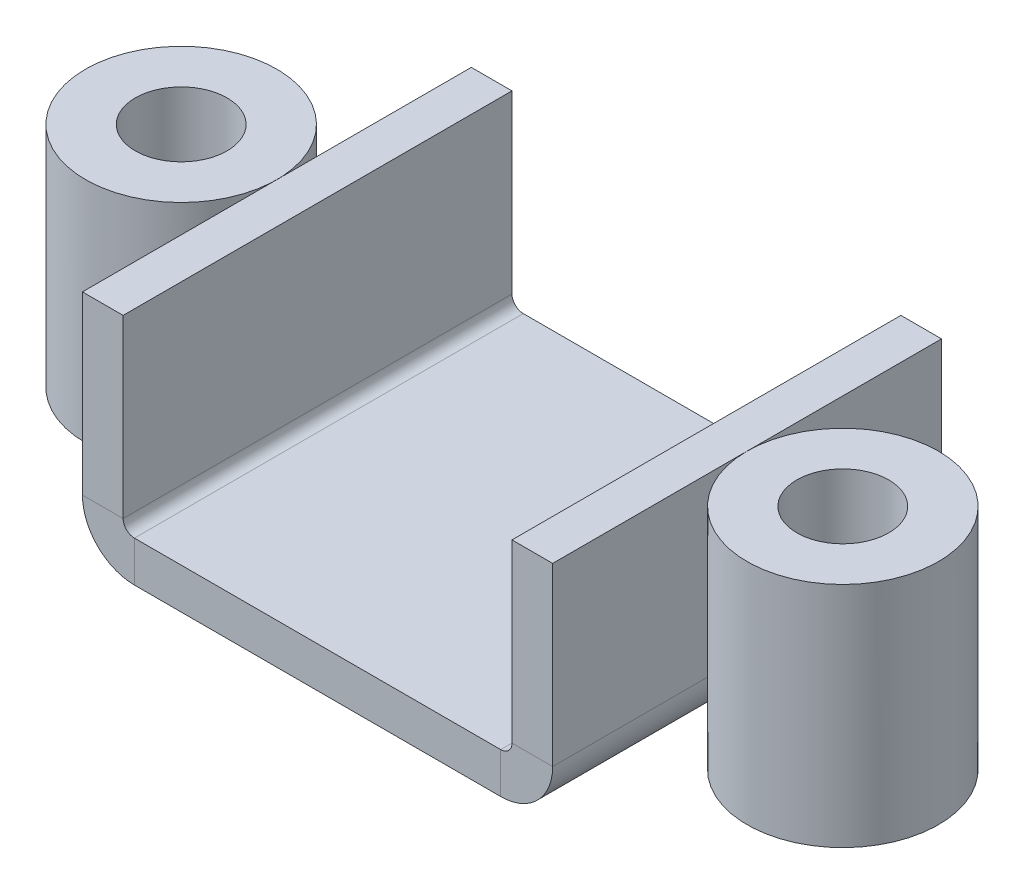
ISO-10303-21;
HEADER;
FILE_DESCRIPTION(('STEP AP214'),'2;1');
FILE_NAME('part.step','',(''),(''),'','','');
FILE_SCHEMA(('AUTOMOTIVE_DESIGN { 1 0 10303 214 1 1 1 1 }'));
ENDSEC;
DATA;
#1=APPLICATION_CONTEXT('core data for automotive mechanical design processes');
#2=APPLICATION_PROTOCOL_DEFINITION('international standard','automotive_design',2000,#1);
#3=PRODUCT_CONTEXT('',#1,'mechanical');
#4=PRODUCT('Part','Part','',(#3));
#5=PRODUCT_RELATED_PRODUCT_CATEGORY('part','',(#4));
#6=PRODUCT_DEFINITION_FORMATION('','',#4);
#7=PRODUCT_DEFINITION_CONTEXT('part definition',#1,'design');
#8=PRODUCT_DEFINITION('design','',#6,#7);
#9=PRODUCT_DEFINITION_SHAPE('','',#8);
#10=(LENGTH_UNIT() NAMED_UNIT(*) SI_UNIT(.MILLI.,.METRE.));
#11=(NAMED_UNIT(*) PLANE_ANGLE_UNIT() SI_UNIT($,.RADIAN.));
#12=(NAMED_UNIT(*) SI_UNIT($,.STERADIAN.) SOLID_ANGLE_UNIT());
#13=UNCERTAINTY_MEASURE_WITH_UNIT(LENGTH_MEASURE(1.E-05),#10,'distance_accuracy_value','');
#14=(GEOMETRIC_REPRESENTATION_CONTEXT(3) GLOBAL_UNCERTAINTY_ASSIGNED_CONTEXT((#13)) GLOBAL_UNIT_ASSIGNED_CONTEXT((#10,
#11,#12)) REPRESENTATION_CONTEXT('',''));
#15=CARTESIAN_POINT('',(0.,0.,0.));
#16=DIRECTION('',(0.,0.,1.));
#17=DIRECTION('',(1.,0.,0.));
#18=AXIS2_PLACEMENT_3D('',#15,#16,#17);
#19=CARTESIAN_POINT('',(-21.60684,29.9071436989057,0.));
#20=DIRECTION('',(0.,-1.,0.));
#21=DIRECTION('',(0.,0.,-1.));
#22=AXIS2_PLACEMENT_3D('',#19,#20,#21);
#23=CYLINDRICAL_SURFACE('',#22,6.25);
#24=CARTESIAN_POINT('',(-21.60684,-2.65684,0.));
#25=DIRECTION('',(0.,-1.,0.));
#26=DIRECTION('',(0.,0.,1.));
#27=AXIS2_PLACEMENT_3D('',#24,#25,#26);
#28=CIRCLE('',#27,6.25);
#29=CARTESIAN_POINT('',(-21.60684,-2.65684,6.25));
#30=VERTEX_POINT('',#29);
#31=EDGE_CURVE('E67',#30,#30,#28,.T.);
#32=ORIENTED_EDGE('',*,*,#31,.F.);
#33=EDGE_LOOP('',(#32));
#34=FACE_BOUND('',#33,.T.);
#35=CARTESIAN_POINT('',(-21.60684,12.2294741692419,0.));
#36=DIRECTION('',(0.,1.,0.));
#37=DIRECTION('',(-1.,0.,0.));
#38=AXIS2_PLACEMENT_3D('',#35,#36,#37);
#39=CIRCLE('',#38,6.25);
#40=CARTESIAN_POINT('',(-27.85684,12.2294741692418,0.));
#41=VERTEX_POINT('',#40);
#42=EDGE_CURVE('E12',#41,#41,#39,.F.);
#43=ORIENTED_EDGE('',*,*,#42,.T.);
#44=EDGE_LOOP('',(#43));
#45=FACE_BOUND('',#44,.T.);
#46=ADVANCED_FACE('F63',(#34,#45),#23,.T.);
#47=CARTESIAN_POINT('',(-21.60684,29.9071436989057,0.));
#48=DIRECTION('',(0.,-1.,0.));
#49=DIRECTION('',(0.,0.,-1.));
#50=AXIS2_PLACEMENT_3D('',#47,#48,#49);
#51=CYLINDRICAL_SURFACE('',#50,3.);
#52=CARTESIAN_POINT('',(-21.60684,-2.65684,0.));
#53=DIRECTION('',(0.,-1.,0.));
#54=DIRECTION('',(0.,0.,1.));
#55=AXIS2_PLACEMENT_3D('',#52,#53,#54);
#56=CIRCLE('',#55,3.);
#57=CARTESIAN_POINT('',(-21.60684,-2.65684,2.99999999999999));
#58=VERTEX_POINT('',#57);
#59=EDGE_CURVE('E72',#58,#58,#56,.T.);
#60=ORIENTED_EDGE('',*,*,#59,.T.);
#61=EDGE_LOOP('',(#60));
#62=FACE_BOUND('',#61,.T.);
#63=CARTESIAN_POINT('',(-21.60684,12.2294741692419,0.));
#64=DIRECTION('',(0.,1.,0.));
#65=DIRECTION('',(-1.,0.,0.));
#66=AXIS2_PLACEMENT_3D('',#63,#64,#65);
#67=CIRCLE('',#66,3.);
#68=CARTESIAN_POINT('',(-24.60684,12.2294741692419,0.));
#69=VERTEX_POINT('',#68);
#70=EDGE_CURVE('E80',#69,#69,#67,.F.);
#71=ORIENTED_EDGE('',*,*,#70,.F.);
#72=EDGE_LOOP('',(#71));
#73=FACE_BOUND('',#72,.T.);
#74=ADVANCED_FACE('F93',(#62,#73),#51,.F.);
#75=CARTESIAN_POINT('',(-21.60684,-2.65684,0.));
#76=DIRECTION('',(0.,1.,0.));
#77=DIRECTION('',(0.,0.,1.));
#78=AXIS2_PLACEMENT_3D('',#75,#76,#77);
#79=PLANE('',#78);
#80=ORIENTED_EDGE('',*,*,#59,.F.);
#81=EDGE_LOOP('',(#80));
#82=FACE_BOUND('',#81,.T.);
#83=ORIENTED_EDGE('',*,*,#31,.T.);
#84=EDGE_LOOP('',(#83));
#85=FACE_BOUND('',#84,.T.);
#86=ADVANCED_FACE('F65',(#82,#85),#79,.F.);
#87=CARTESIAN_POINT('',(15.35684,12.229474169242,12.7));
#88=DIRECTION('',(0.,1.,0.));
#89=DIRECTION('',(0.,0.,-1.));
#90=AXIS2_PLACEMENT_3D('',#87,#88,#89);
#91=PLANE('',#90);
#92=ORIENTED_EDGE('',*,*,#42,.F.);
#93=EDGE_LOOP('',(#92));
#94=FACE_BOUND('',#93,.T.);
#95=ORIENTED_EDGE('',*,*,#70,.T.);
#96=EDGE_LOOP('',(#95));
#97=FACE_BOUND('',#96,.T.);
#98=ADVANCED_FACE('F100',(#94,#97),#91,.T.);
#99=CLOSED_SHELL('',(#46,#74,#86,#98));
#100=MANIFOLD_SOLID_BREP('B2',#99);
#101=CARTESIAN_POINT('',(21.60684,29.9071436989057,0.));
#102=DIRECTION('',(0.,-1.,0.));
#103=DIRECTION('',(0.,0.,-1.));
#104=AXIS2_PLACEMENT_3D('',#101,#102,#103);
#105=CYLINDRICAL_SURFACE('',#104,6.25);
#106=CARTESIAN_POINT('',(21.60684,-2.65684,0.));
#107=DIRECTION('',(0.,-1.,0.));
#108=DIRECTION('',(0.,0.,-1.));
#109=AXIS2_PLACEMENT_3D('',#106,#107,#108);
#110=CIRCLE('',#109,6.25);
#111=CARTESIAN_POINT('',(21.60684,-2.65684,-6.25));
#112=VERTEX_POINT('',#111);
#113=EDGE_CURVE('E149',#112,#112,#110,.T.);
#114=ORIENTED_EDGE('',*,*,#113,.F.);
#115=EDGE_LOOP('',(#114));
#116=FACE_BOUND('',#115,.T.);
#117=CARTESIAN_POINT('',(21.60684,12.229474169242,0.));
#118=DIRECTION('',(0.,1.,0.));
#119=DIRECTION('',(-1.,0.,0.));
#120=AXIS2_PLACEMENT_3D('',#117,#118,#119);
#121=CIRCLE('',#120,6.25);
#122=CARTESIAN_POINT('',(15.35684,12.229474169242,0.));
#123=VERTEX_POINT('',#122);
#124=EDGE_CURVE('E162',#123,#123,#121,.F.);
#125=ORIENTED_EDGE('',*,*,#124,.T.);
#126=EDGE_LOOP('',(#125));
#127=FACE_BOUND('',#126,.T.);
#128=ADVANCED_FACE('F141',(#116,#127),#105,.T.);
#129=CARTESIAN_POINT('',(21.60684,29.9071436989057,0.));
#130=DIRECTION('',(0.,-1.,0.));
#131=DIRECTION('',(0.,0.,-1.));
#132=AXIS2_PLACEMENT_3D('',#129,#130,#131);
#133=CYLINDRICAL_SURFACE('',#132,3.);
#134=CARTESIAN_POINT('',(21.60684,-2.65684,0.));
#135=DIRECTION('',(0.,-1.,0.));
#136=DIRECTION('',(0.,0.,-1.));
#137=AXIS2_PLACEMENT_3D('',#134,#135,#136);
#138=CIRCLE('',#137,3.);
#139=CARTESIAN_POINT('',(21.60684,-2.65684,-3.));
#140=VERTEX_POINT('',#139);
#141=EDGE_CURVE('E155',#140,#140,#138,.T.);
#142=ORIENTED_EDGE('',*,*,#141,.T.);
#143=EDGE_LOOP('',(#142));
#144=FACE_BOUND('',#143,.T.);
#145=CARTESIAN_POINT('',(21.60684,12.229474169242,0.));
#146=DIRECTION('',(0.,1.,0.));
#147=DIRECTION('',(-1.,0.,0.));
#148=AXIS2_PLACEMENT_3D('',#145,#146,#147);
#149=CIRCLE('',#148,3.);
#150=CARTESIAN_POINT('',(18.60684,12.229474169242,0.));
#151=VERTEX_POINT('',#150);
#152=EDGE_CURVE('E62',#151,#151,#149,.F.);
#153=ORIENTED_EDGE('',*,*,#152,.F.);
#154=EDGE_LOOP('',(#153));
#155=FACE_BOUND('',#154,.T.);
#156=ADVANCED_FACE('F175',(#144,#155),#133,.F.);
#157=CARTESIAN_POINT('',(21.60684,-2.65684,0.));
#158=DIRECTION('',(0.,-1.,0.));
#159=DIRECTION('',(0.,0.,-1.));
#160=AXIS2_PLACEMENT_3D('',#157,#158,#159);
#161=PLANE('',#160);
#162=ORIENTED_EDGE('',*,*,#141,.F.);
#163=EDGE_LOOP('',(#162));
#164=FACE_BOUND('',#163,.T.);
#165=ORIENTED_EDGE('',*,*,#113,.T.);
#166=EDGE_LOOP('',(#165));
#167=FACE_BOUND('',#166,.T.);
#168=ADVANCED_FACE('F171',(#164,#167),#161,.T.);
#169=CARTESIAN_POINT('',(15.35684,12.229474169242,12.7));
#170=DIRECTION('',(0.,1.,0.));
#171=DIRECTION('',(0.,0.,-1.));
#172=AXIS2_PLACEMENT_3D('',#169,#170,#171);
#173=PLANE('',#172);
#174=ORIENTED_EDGE('',*,*,#124,.F.);
#175=EDGE_LOOP('',(#174));
#176=FACE_BOUND('',#175,.T.);
#177=ORIENTED_EDGE('',*,*,#152,.T.);
#178=EDGE_LOOP('',(#177));
#179=FACE_BOUND('',#178,.T.);
#180=ADVANCED_FACE('F143',(#176,#179),#173,.T.);
#181=CLOSED_SHELL('',(#128,#156,#168,#180));
#182=MANIFOLD_SOLID_BREP('B7',#181);
#183=CARTESIAN_POINT('',(0.,-2.65684,0.));
#184=DIRECTION('',(0.,-1.,0.));
#185=DIRECTION('',(0.,0.,-1.));
#186=AXIS2_PLACEMENT_3D('',#183,#184,#185);
#187=PLANE('',#186);
#188=DIRECTION('',(-1.,0.,0.));
#189=VECTOR('',#188,1.);
#190=CARTESIAN_POINT('',(-26.7,-2.65684,-12.7));
#191=LINE('',#190,#189);
#192=CARTESIAN_POINT('',(11.9634,-2.65684,-12.7));
#193=VERTEX_POINT('',#192);
#194=CARTESIAN_POINT('',(-11.9634,-2.65684,-12.7));
#195=VERTEX_POINT('',#194);
#196=EDGE_CURVE('E214',#193,#195,#191,.T.);
#197=ORIENTED_EDGE('',*,*,#196,.F.);
#198=DIRECTION('',(0.,0.,1.));
#199=VECTOR('',#198,1.);
#200=CARTESIAN_POINT('',(11.9634,-2.65684,0.));
#201=LINE('',#200,#199);
#202=CARTESIAN_POINT('',(11.9634,-2.65684,12.7));
#203=VERTEX_POINT('',#202);
#204=EDGE_CURVE('E434',#193,#203,#201,.T.);
#205=ORIENTED_EDGE('',*,*,#204,.T.);
#206=DIRECTION('',(1.,0.,0.));
#207=VECTOR('',#206,1.);
#208=CARTESIAN_POINT('',(-26.7,-2.65684,12.7));
#209=LINE('',#208,#207);
#210=CARTESIAN_POINT('',(-11.9634,-2.65684,12.7));
#211=VERTEX_POINT('',#210);
#212=EDGE_CURVE('E423',#211,#203,#209,.T.);
#213=ORIENTED_EDGE('',*,*,#212,.F.);
#214=DIRECTION('',(0.,0.,1.));
#215=VECTOR('',#214,1.);
#216=CARTESIAN_POINT('',(-11.9634,-2.65684,0.));
#217=LINE('',#216,#215);
#218=EDGE_CURVE('E418',#195,#211,#217,.T.);
#219=ORIENTED_EDGE('',*,*,#218,.F.);
#220=EDGE_LOOP('',(#197,#205,#213,#219));
#221=FACE_BOUND('',#220,.T.);
#222=ADVANCED_FACE('F210',(#221),#187,.T.);
#223=CARTESIAN_POINT('',(-26.7,-2.65684,-12.7));
#224=DIRECTION('',(0.,0.,-1.));
#225=DIRECTION('',(-1.,0.,0.));
#226=AXIS2_PLACEMENT_3D('',#223,#224,#225);
#227=PLANE('',#226);
#228=DIRECTION('',(-1.,0.,0.));
#229=VECTOR('',#228,1.);
#230=CARTESIAN_POINT('',(-26.7,0.,-12.7));
#231=LINE('',#230,#229);
#232=CARTESIAN_POINT('',(11.9634,0.,-12.7));
#233=VERTEX_POINT('',#232);
#234=CARTESIAN_POINT('',(-11.9634,0.,-12.7));
#235=VERTEX_POINT('',#234);
#236=EDGE_CURVE('E234',#233,#235,#231,.T.);
#237=ORIENTED_EDGE('',*,*,#236,.F.);
#238=DIRECTION('',(0.,-1.,0.));
#239=VECTOR('',#238,1.);
#240=CARTESIAN_POINT('',(11.9634,-2.65684,-12.7));
#241=LINE('',#240,#239);
#242=EDGE_CURVE('E438',#233,#193,#241,.T.);
#243=ORIENTED_EDGE('',*,*,#242,.T.);
#244=ORIENTED_EDGE('',*,*,#196,.T.);
#245=DIRECTION('',(0.,-1.,0.));
#246=VECTOR('',#245,1.);
#247=CARTESIAN_POINT('',(-11.9634,-2.65684,-12.7));
#248=LINE('',#247,#246);
#249=EDGE_CURVE('E430',#235,#195,#248,.T.);
#250=ORIENTED_EDGE('',*,*,#249,.F.);
#251=EDGE_LOOP('',(#237,#243,#244,#250));
#252=FACE_BOUND('',#251,.T.);
#253=ADVANCED_FACE('F546',(#252),#227,.T.);
#254=CARTESIAN_POINT('',(-26.7,-2.65684,12.7));
#255=DIRECTION('',(0.,0.,1.));
#256=DIRECTION('',(1.,0.,0.));
#257=AXIS2_PLACEMENT_3D('',#254,#255,#256);
#258=PLANE('',#257);
#259=ORIENTED_EDGE('',*,*,#212,.T.);
#260=DIRECTION('',(0.,1.,0.));
#261=VECTOR('',#260,1.);
#262=CARTESIAN_POINT('',(11.9634,-2.65684,12.7));
#263=LINE('',#262,#261);
#264=CARTESIAN_POINT('',(11.9634,0.,12.7));
#265=VERTEX_POINT('',#264);
#266=EDGE_CURVE('E139',#203,#265,#263,.T.);
#267=ORIENTED_EDGE('',*,*,#266,.T.);
#268=DIRECTION('',(1.,0.,0.));
#269=VECTOR('',#268,1.);
#270=CARTESIAN_POINT('',(-26.7,0.,12.7));
#271=LINE('',#270,#269);
#272=CARTESIAN_POINT('',(-11.9634,0.,12.7));
#273=VERTEX_POINT('',#272);
#274=EDGE_CURVE('E447',#273,#265,#271,.T.);
#275=ORIENTED_EDGE('',*,*,#274,.F.);
#276=DIRECTION('',(0.,1.,0.));
#277=VECTOR('',#276,1.);
#278=CARTESIAN_POINT('',(-11.9634,-2.65684,12.7));
#279=LINE('',#278,#277);
#280=EDGE_CURVE('E422',#211,#273,#279,.T.);
#281=ORIENTED_EDGE('',*,*,#280,.F.);
#282=EDGE_LOOP('',(#259,#267,#275,#281));
#283=FACE_BOUND('',#282,.T.);
#284=ADVANCED_FACE('F212',(#283),#258,.T.);
#285=CARTESIAN_POINT('',(0.,0.,0.));
#286=DIRECTION('',(0.,-1.,0.));
#287=DIRECTION('',(0.,0.,-1.));
#288=AXIS2_PLACEMENT_3D('',#285,#286,#287);
#289=PLANE('',#288);
#290=DIRECTION('',(0.,0.,1.));
#291=VECTOR('',#290,1.);
#292=CARTESIAN_POINT('',(11.9634,0.,0.));
#293=LINE('',#292,#291);
#294=EDGE_CURVE('E220',#233,#265,#293,.T.);
#295=ORIENTED_EDGE('',*,*,#294,.F.);
#296=ORIENTED_EDGE('',*,*,#236,.T.);
#297=DIRECTION('',(0.,0.,1.));
#298=VECTOR('',#297,1.);
#299=CARTESIAN_POINT('',(-11.9634,0.,0.));
#300=LINE('',#299,#298);
#301=EDGE_CURVE('E427',#235,#273,#300,.T.);
#302=ORIENTED_EDGE('',*,*,#301,.T.);
#303=ORIENTED_EDGE('',*,*,#274,.T.);
#304=EDGE_LOOP('',(#295,#296,#302,#303));
#305=FACE_BOUND('',#304,.T.);
#306=ADVANCED_FACE('F604',(#305),#289,.F.);
#307=CARTESIAN_POINT('',(-11.9634,0.7366,-12.7));
#308=DIRECTION('',(0.,0.,-1.));
#309=DIRECTION('',(-1.,0.,0.));
#310=AXIS2_PLACEMENT_3D('',#307,#308,#309);
#311=PLANE('',#310);
#312=DIRECTION('',(-1.,0.,0.));
#313=VECTOR('',#312,1.);
#314=CARTESIAN_POINT('',(-15.35684,0.736600000000011,-12.7));
#315=LINE('',#314,#313);
#316=CARTESIAN_POINT('',(-12.7,0.736600000000002,-12.7));
#317=VERTEX_POINT('',#316);
#318=CARTESIAN_POINT('',(-15.35684,0.736600000000011,-12.7));
#319=VERTEX_POINT('',#318);
#320=EDGE_CURVE('E369',#317,#319,#315,.T.);
#321=ORIENTED_EDGE('',*,*,#320,.F.);
#322=CARTESIAN_POINT('',(-11.9634,0.7366,-12.7));
#323=DIRECTION('',(0.,0.,-1.));
#324=DIRECTION('',(-1.,0.,0.));
#325=AXIS2_PLACEMENT_3D('',#322,#323,#324);
#326=CIRCLE('',#325,0.7366);
#327=EDGE_CURVE('E365',#317,#235,#326,.F.);
#328=ORIENTED_EDGE('',*,*,#327,.T.);
#329=ORIENTED_EDGE('',*,*,#249,.T.);
#330=CARTESIAN_POINT('',(-11.9634,0.7366,-12.7));
#331=DIRECTION('',(0.,0.,1.));
#332=DIRECTION('',(-1.,0.,0.));
#333=AXIS2_PLACEMENT_3D('',#330,#331,#332);
#334=CIRCLE('',#333,3.39344);
#335=EDGE_CURVE('E403',#319,#195,#334,.T.);
#336=ORIENTED_EDGE('',*,*,#335,.F.);
#337=EDGE_LOOP('',(#321,#328,#329,#336));
#338=FACE_BOUND('',#337,.T.);
#339=ADVANCED_FACE('F576',(#338),#311,.T.);
#340=CARTESIAN_POINT('',(-11.9634,0.7366,12.7));
#341=DIRECTION('',(0.,0.,1.));
#342=DIRECTION('',(1.,0.,0.));
#343=AXIS2_PLACEMENT_3D('',#340,#341,#342);
#344=PLANE('',#343);
#345=CARTESIAN_POINT('',(-11.9634,0.7366,12.7));
#346=DIRECTION('',(0.,0.,-1.));
#347=DIRECTION('',(-1.,0.,0.));
#348=AXIS2_PLACEMENT_3D('',#345,#346,#347);
#349=CIRCLE('',#348,0.7366);
#350=CARTESIAN_POINT('',(-12.7,0.736600000000002,12.7));
#351=VERTEX_POINT('',#350);
#352=EDGE_CURVE('E408',#273,#351,#349,.T.);
#353=ORIENTED_EDGE('',*,*,#352,.T.);
#354=DIRECTION('',(1.,0.,0.));
#355=VECTOR('',#354,1.);
#356=CARTESIAN_POINT('',(-15.35684,0.736600000000011,12.7));
#357=LINE('',#356,#355);
#358=CARTESIAN_POINT('',(-15.35684,0.736600000000011,12.7));
#359=VERTEX_POINT('',#358);
#360=EDGE_CURVE('E382',#359,#351,#357,.T.);
#361=ORIENTED_EDGE('',*,*,#360,.F.);
#362=CARTESIAN_POINT('',(-11.9634,0.7366,12.7));
#363=DIRECTION('',(0.,0.,-1.));
#364=DIRECTION('',(1.,0.,0.));
#365=AXIS2_PLACEMENT_3D('',#362,#363,#364);
#366=CIRCLE('',#365,3.39344);
#367=EDGE_CURVE('E407',#211,#359,#366,.T.);
#368=ORIENTED_EDGE('',*,*,#367,.F.);
#369=ORIENTED_EDGE('',*,*,#280,.T.);
#370=EDGE_LOOP('',(#353,#361,#368,#369));
#371=FACE_BOUND('',#370,.T.);
#372=ADVANCED_FACE('F562',(#371),#344,.T.);
#373=CARTESIAN_POINT('',(-11.9634,0.7366,25.7437479021747));
#374=DIRECTION('',(0.,0.,-1.));
#375=DIRECTION('',(-1.,0.,0.));
#376=AXIS2_PLACEMENT_3D('',#373,#374,#375);
#377=CYLINDRICAL_SURFACE('',#376,3.39344);
#378=ORIENTED_EDGE('',*,*,#218,.T.);
#379=ORIENTED_EDGE('',*,*,#367,.T.);
#380=DIRECTION('',(0.,0.,1.));
#381=VECTOR('',#380,1.);
#382=CARTESIAN_POINT('',(-15.35684,0.736600000000011,0.));
#383=LINE('',#382,#381);
#384=EDGE_CURVE('E390',#319,#359,#383,.T.);
#385=ORIENTED_EDGE('',*,*,#384,.F.);
#386=ORIENTED_EDGE('',*,*,#335,.T.);
#387=EDGE_LOOP('',(#378,#379,#385,#386));
#388=FACE_BOUND('',#387,.T.);
#389=ADVANCED_FACE('F558',(#388),#377,.T.);
#390=CARTESIAN_POINT('',(-11.9634,0.7366,25.7437479021747));
#391=DIRECTION('',(0.,0.,-1.));
#392=DIRECTION('',(-1.,0.,0.));
#393=AXIS2_PLACEMENT_3D('',#390,#391,#392);
#394=CYLINDRICAL_SURFACE('',#393,0.7366);
#395=ORIENTED_EDGE('',*,*,#301,.F.);
#396=ORIENTED_EDGE('',*,*,#327,.F.);
#397=DIRECTION('',(0.,0.,1.));
#398=VECTOR('',#397,1.);
#399=CARTESIAN_POINT('',(-12.7,0.736600000000002,0.));
#400=LINE('',#399,#398);
#401=EDGE_CURVE('E355',#317,#351,#400,.T.);
#402=ORIENTED_EDGE('',*,*,#401,.T.);
#403=ORIENTED_EDGE('',*,*,#352,.F.);
#404=EDGE_LOOP('',(#395,#396,#402,#403));
#405=FACE_BOUND('',#404,.T.);
#406=ADVANCED_FACE('F571',(#405),#394,.F.);
#407=CARTESIAN_POINT('',(-15.35684,12.229474169242,12.7));
#408=DIRECTION('',(0.,1.,0.));
#409=DIRECTION('',(0.,0.,1.));
#410=AXIS2_PLACEMENT_3D('',#407,#408,#409);
#411=PLANE('',#410);
#412=DIRECTION('',(0.,0.,1.));
#413=VECTOR('',#412,1.);
#414=CARTESIAN_POINT('',(-12.7,12.229474169242,12.7));
#415=LINE('',#414,#413);
#416=CARTESIAN_POINT('',(-12.7,12.229474169242,-12.7));
#417=VERTEX_POINT('',#416);
#418=CARTESIAN_POINT('',(-12.7,12.229474169242,12.7));
#419=VERTEX_POINT('',#418);
#420=EDGE_CURVE('E375',#417,#419,#415,.T.);
#421=ORIENTED_EDGE('',*,*,#420,.F.);
#422=DIRECTION('',(1.,0.,0.));
#423=VECTOR('',#422,1.);
#424=CARTESIAN_POINT('',(-15.35684,12.229474169242,-12.7));
#425=LINE('',#424,#423);
#426=CARTESIAN_POINT('',(-15.35684,12.229474169242,-12.7));
#427=VERTEX_POINT('',#426);
#428=EDGE_CURVE('E361',#427,#417,#425,.T.);
#429=ORIENTED_EDGE('',*,*,#428,.F.);
#430=DIRECTION('',(0.,0.,1.));
#431=VECTOR('',#430,1.);
#432=CARTESIAN_POINT('',(-15.35684,12.229474169242,12.7));
#433=LINE('',#432,#431);
#434=CARTESIAN_POINT('',(-15.35684,12.229474169242,12.7));
#435=VERTEX_POINT('',#434);
#436=EDGE_CURVE('E396',#427,#435,#433,.T.);
#437=ORIENTED_EDGE('',*,*,#436,.T.);
#438=DIRECTION('',(1.,0.,0.));
#439=VECTOR('',#438,1.);
#440=CARTESIAN_POINT('',(-15.35684,12.229474169242,12.7));
#441=LINE('',#440,#439);
#442=EDGE_CURVE('E393',#435,#419,#441,.T.);
#443=ORIENTED_EDGE('',*,*,#442,.T.);
#444=EDGE_LOOP('',(#421,#429,#437,#443));
#445=FACE_BOUND('',#444,.T.);
#446=ADVANCED_FACE('F586',(#445),#411,.T.);
#447=CARTESIAN_POINT('',(-15.3568400000001,-14.470525830758,0.));
#448=DIRECTION('',(-1.,0.,0.));
#449=DIRECTION('',(0.,0.,-1.));
#450=AXIS2_PLACEMENT_3D('',#447,#448,#449);
#451=PLANE('',#450);
#452=DIRECTION('',(0.,1.,0.));
#453=VECTOR('',#452,1.);
#454=CARTESIAN_POINT('',(-15.35684,12.229474169242,-12.7));
#455=LINE('',#454,#453);
#456=EDGE_CURVE('E366',#319,#427,#455,.T.);
#457=ORIENTED_EDGE('',*,*,#456,.F.);
#458=ORIENTED_EDGE('',*,*,#384,.T.);
#459=DIRECTION('',(0.,-1.,0.));
#460=VECTOR('',#459,1.);
#461=CARTESIAN_POINT('',(-15.35684,12.229474169242,12.7));
#462=LINE('',#461,#460);
#463=EDGE_CURVE('E386',#435,#359,#462,.T.);
#464=ORIENTED_EDGE('',*,*,#463,.F.);
#465=ORIENTED_EDGE('',*,*,#436,.F.);
#466=EDGE_LOOP('',(#457,#458,#464,#465));
#467=FACE_BOUND('',#466,.T.);
#468=ADVANCED_FACE('F583',(#467),#451,.T.);
#469=CARTESIAN_POINT('',(-15.35684,12.229474169242,12.7));
#470=DIRECTION('',(0.,0.,1.));
#471=DIRECTION('',(0.,-1.,0.));
#472=AXIS2_PLACEMENT_3D('',#469,#470,#471);
#473=PLANE('',#472);
#474=ORIENTED_EDGE('',*,*,#463,.T.);
#475=ORIENTED_EDGE('',*,*,#360,.T.);
#476=DIRECTION('',(0.,-1.,0.));
#477=VECTOR('',#476,1.);
#478=CARTESIAN_POINT('',(-12.7,12.229474169242,12.7));
#479=LINE('',#478,#477);
#480=EDGE_CURVE('E372',#419,#351,#479,.T.);
#481=ORIENTED_EDGE('',*,*,#480,.F.);
#482=ORIENTED_EDGE('',*,*,#442,.F.);
#483=EDGE_LOOP('',(#474,#475,#481,#482));
#484=FACE_BOUND('',#483,.T.);
#485=ADVANCED_FACE('F565',(#484),#473,.T.);
#486=CARTESIAN_POINT('',(-12.7000000000001,-14.470525830758,0.));
#487=DIRECTION('',(-1.,0.,0.));
#488=DIRECTION('',(0.,0.,-1.));
#489=AXIS2_PLACEMENT_3D('',#486,#487,#488);
#490=PLANE('',#489);
#491=ORIENTED_EDGE('',*,*,#401,.F.);
#492=DIRECTION('',(0.,1.,0.));
#493=VECTOR('',#492,1.);
#494=CARTESIAN_POINT('',(-12.7,12.229474169242,-12.7));
#495=LINE('',#494,#493);
#496=EDGE_CURVE('E379',#317,#417,#495,.T.);
#497=ORIENTED_EDGE('',*,*,#496,.T.);
#498=ORIENTED_EDGE('',*,*,#420,.T.);
#499=ORIENTED_EDGE('',*,*,#480,.T.);
#500=EDGE_LOOP('',(#491,#497,#498,#499));
#501=FACE_BOUND('',#500,.T.);
#502=ADVANCED_FACE('F574',(#501),#490,.F.);
#503=CARTESIAN_POINT('',(-15.35684,12.229474169242,-12.7));
#504=DIRECTION('',(0.,0.,-1.));
#505=DIRECTION('',(0.,1.,0.));
#506=AXIS2_PLACEMENT_3D('',#503,#504,#505);
#507=PLANE('',#506);
#508=ORIENTED_EDGE('',*,*,#496,.F.);
#509=ORIENTED_EDGE('',*,*,#320,.T.);
#510=ORIENTED_EDGE('',*,*,#456,.T.);
#511=ORIENTED_EDGE('',*,*,#428,.T.);
#512=EDGE_LOOP('',(#508,#509,#510,#511));
#513=FACE_BOUND('',#512,.T.);
#514=ADVANCED_FACE('F579',(#513),#507,.T.);
#515=CARTESIAN_POINT('',(11.9634,0.7366,-12.7));
#516=DIRECTION('',(0.,0.,-1.));
#517=DIRECTION('',(-1.,0.,0.));
#518=AXIS2_PLACEMENT_3D('',#515,#516,#517);
#519=PLANE('',#518);
#520=ORIENTED_EDGE('',*,*,#242,.F.);
#521=CARTESIAN_POINT('',(11.9634,0.7366,-12.7));
#522=DIRECTION('',(0.,0.,1.));
#523=DIRECTION('',(1.,0.,0.));
#524=AXIS2_PLACEMENT_3D('',#521,#522,#523);
#525=CIRCLE('',#524,0.7366);
#526=CARTESIAN_POINT('',(12.7,0.736600000000002,-12.7));
#527=VERTEX_POINT('',#526);
#528=EDGE_CURVE('E323',#233,#527,#525,.T.);
#529=ORIENTED_EDGE('',*,*,#528,.T.);
#530=DIRECTION('',(1.,0.,0.));
#531=VECTOR('',#530,1.);
#532=CARTESIAN_POINT('',(15.35684,0.736600000000011,-12.7));
#533=LINE('',#532,#531);
#534=CARTESIAN_POINT('',(15.35684,0.736600000000011,-12.7));
#535=VERTEX_POINT('',#534);
#536=EDGE_CURVE('E331',#527,#535,#533,.T.);
#537=ORIENTED_EDGE('',*,*,#536,.T.);
#538=CARTESIAN_POINT('',(11.9634,0.7366,-12.7));
#539=DIRECTION('',(0.,0.,1.));
#540=DIRECTION('',(-1.,0.,0.));
#541=AXIS2_PLACEMENT_3D('',#538,#539,#540);
#542=CIRCLE('',#541,3.39344);
#543=EDGE_CURVE('E346',#193,#535,#542,.T.);
#544=ORIENTED_EDGE('',*,*,#543,.F.);
#545=EDGE_LOOP('',(#520,#529,#537,#544));
#546=FACE_BOUND('',#545,.T.);
#547=ADVANCED_FACE('F537',(#546),#519,.T.);
#548=CARTESIAN_POINT('',(11.9634,0.7366,12.7));
#549=DIRECTION('',(0.,0.,1.));
#550=DIRECTION('',(1.,0.,0.));
#551=AXIS2_PLACEMENT_3D('',#548,#549,#550);
#552=PLANE('',#551);
#553=DIRECTION('',(-1.,0.,0.));
#554=VECTOR('',#553,1.);
#555=CARTESIAN_POINT('',(15.35684,0.736600000000011,12.7));
#556=LINE('',#555,#554);
#557=CARTESIAN_POINT('',(15.35684,0.736600000000005,12.7));
#558=VERTEX_POINT('',#557);
#559=CARTESIAN_POINT('',(12.7,0.736600000000002,12.7));
#560=VERTEX_POINT('',#559);
#561=EDGE_CURVE('E310',#558,#560,#556,.T.);
#562=ORIENTED_EDGE('',*,*,#561,.T.);
#563=CARTESIAN_POINT('',(11.9634,0.7366,12.7));
#564=DIRECTION('',(0.,0.,1.));
#565=DIRECTION('',(1.,0.,0.));
#566=AXIS2_PLACEMENT_3D('',#563,#564,#565);
#567=CIRCLE('',#566,0.7366);
#568=EDGE_CURVE('E351',#560,#265,#567,.F.);
#569=ORIENTED_EDGE('',*,*,#568,.T.);
#570=ORIENTED_EDGE('',*,*,#266,.F.);
#571=CARTESIAN_POINT('',(11.9634,0.7366,12.7));
#572=DIRECTION('',(0.,0.,-1.));
#573=DIRECTION('',(1.,0.,0.));
#574=AXIS2_PLACEMENT_3D('',#571,#572,#573);
#575=CIRCLE('',#574,3.39344);
#576=EDGE_CURVE('E350',#558,#203,#575,.T.);
#577=ORIENTED_EDGE('',*,*,#576,.F.);
#578=EDGE_LOOP('',(#562,#569,#570,#577));
#579=FACE_BOUND('',#578,.T.);
#580=ADVANCED_FACE('F551',(#579),#552,.T.);
#581=CARTESIAN_POINT('',(11.9634,0.7366,-25.7437479021747));
#582=DIRECTION('',(0.,0.,1.));
#583=DIRECTION('',(1.,0.,0.));
#584=AXIS2_PLACEMENT_3D('',#581,#582,#583);
#585=CYLINDRICAL_SURFACE('',#584,3.39344);
#586=ORIENTED_EDGE('',*,*,#576,.T.);
#587=ORIENTED_EDGE('',*,*,#204,.F.);
#588=ORIENTED_EDGE('',*,*,#543,.T.);
#589=DIRECTION('',(0.,0.,1.));
#590=VECTOR('',#589,1.);
#591=CARTESIAN_POINT('',(15.35684,0.736600000000011,0.));
#592=LINE('',#591,#590);
#593=EDGE_CURVE('E343',#535,#558,#592,.T.);
#594=ORIENTED_EDGE('',*,*,#593,.T.);
#595=EDGE_LOOP('',(#586,#587,#588,#594));
#596=FACE_BOUND('',#595,.T.);
#597=ADVANCED_FACE('F540',(#596),#585,.T.);
#598=CARTESIAN_POINT('',(11.9634,0.7366,-25.7437479021747));
#599=DIRECTION('',(0.,0.,1.));
#600=DIRECTION('',(1.,0.,0.));
#601=AXIS2_PLACEMENT_3D('',#598,#599,#600);
#602=CYLINDRICAL_SURFACE('',#601,0.7366);
#603=ORIENTED_EDGE('',*,*,#568,.F.);
#604=DIRECTION('',(0.,0.,1.));
#605=VECTOR('',#604,1.);
#606=CARTESIAN_POINT('',(12.7,0.736600000000002,0.));
#607=LINE('',#606,#605);
#608=EDGE_CURVE('E507',#527,#560,#607,.T.);
#609=ORIENTED_EDGE('',*,*,#608,.F.);
#610=ORIENTED_EDGE('',*,*,#528,.F.);
#611=ORIENTED_EDGE('',*,*,#294,.T.);
#612=EDGE_LOOP('',(#603,#609,#610,#611));
#613=FACE_BOUND('',#612,.T.);
#614=ADVANCED_FACE('F547',(#613),#602,.F.);
#615=CARTESIAN_POINT('',(15.35684,12.229474169242,12.7));
#616=DIRECTION('',(0.,1.,0.));
#617=DIRECTION('',(0.,0.,-1.));
#618=AXIS2_PLACEMENT_3D('',#615,#616,#617);
#619=PLANE('',#618);
#620=DIRECTION('',(0.,0.,-1.));
#621=VECTOR('',#620,1.);
#622=CARTESIAN_POINT('',(12.7,12.229474169242,12.7));
#623=LINE('',#622,#621);
#624=CARTESIAN_POINT('',(12.7,12.229474169242,12.7));
#625=VERTEX_POINT('',#624);
#626=CARTESIAN_POINT('',(12.7,12.229474169242,-12.7));
#627=VERTEX_POINT('',#626);
#628=EDGE_CURVE('E315',#625,#627,#623,.T.);
#629=ORIENTED_EDGE('',*,*,#628,.F.);
#630=DIRECTION('',(-1.,0.,0.));
#631=VECTOR('',#630,1.);
#632=CARTESIAN_POINT('',(15.35684,12.229474169242,12.7));
#633=LINE('',#632,#631);
#634=CARTESIAN_POINT('',(15.35684,12.229474169242,12.7));
#635=VERTEX_POINT('',#634);
#636=EDGE_CURVE('E307',#635,#625,#633,.T.);
#637=ORIENTED_EDGE('',*,*,#636,.F.);
#638=DIRECTION('',(0.,0.,-1.));
#639=VECTOR('',#638,1.);
#640=CARTESIAN_POINT('',(15.35684,12.229474169242,12.7));
#641=LINE('',#640,#639);
#642=CARTESIAN_POINT('',(15.35684,12.229474169242,-12.7));
#643=VERTEX_POINT('',#642);
#644=EDGE_CURVE('E320',#635,#643,#641,.T.);
#645=ORIENTED_EDGE('',*,*,#644,.T.);
#646=DIRECTION('',(-1.,0.,0.));
#647=VECTOR('',#646,1.);
#648=CARTESIAN_POINT('',(15.35684,12.229474169242,-12.7));
#649=LINE('',#648,#647);
#650=EDGE_CURVE('E330',#643,#627,#649,.T.);
#651=ORIENTED_EDGE('',*,*,#650,.T.);
#652=EDGE_LOOP('',(#629,#637,#645,#651));
#653=FACE_BOUND('',#652,.T.);
#654=ADVANCED_FACE('F319',(#653),#619,.T.);
#655=CARTESIAN_POINT('',(15.3568400000001,-14.470525830758,0.));
#656=DIRECTION('',(1.,0.,0.));
#657=DIRECTION('',(0.,0.,-1.));
#658=AXIS2_PLACEMENT_3D('',#655,#656,#657);
#659=PLANE('',#658);
#660=ORIENTED_EDGE('',*,*,#593,.F.);
#661=DIRECTION('',(0.,-1.,0.));
#662=VECTOR('',#661,1.);
#663=CARTESIAN_POINT('',(15.3568400000001,-41.170525830758,-12.7));
#664=LINE('',#663,#662);
#665=EDGE_CURVE('E328',#643,#535,#664,.T.);
#666=ORIENTED_EDGE('',*,*,#665,.F.);
#667=ORIENTED_EDGE('',*,*,#644,.F.);
#668=DIRECTION('',(0.,1.,0.));
#669=VECTOR('',#668,1.);
#670=CARTESIAN_POINT('',(15.3568400000001,-41.170525830758,12.7));
#671=LINE('',#670,#669);
#672=EDGE_CURVE('E304',#558,#635,#671,.T.);
#673=ORIENTED_EDGE('',*,*,#672,.F.);
#674=EDGE_LOOP('',(#660,#666,#667,#673));
#675=FACE_BOUND('',#674,.T.);
#676=ADVANCED_FACE('F326',(#675),#659,.T.);
#677=CARTESIAN_POINT('',(15.3568400000001,-41.170525830758,-12.7));
#678=DIRECTION('',(0.,0.,-1.));
#679=DIRECTION('',(0.,-1.,0.));
#680=AXIS2_PLACEMENT_3D('',#677,#678,#679);
#681=PLANE('',#680);
#682=ORIENTED_EDGE('',*,*,#536,.F.);
#683=DIRECTION('',(0.,-1.,0.));
#684=VECTOR('',#683,1.);
#685=CARTESIAN_POINT('',(12.7000000000001,-41.170525830758,-12.7));
#686=LINE('',#685,#684);
#687=EDGE_CURVE('E513',#627,#527,#686,.T.);
#688=ORIENTED_EDGE('',*,*,#687,.F.);
#689=ORIENTED_EDGE('',*,*,#650,.F.);
#690=ORIENTED_EDGE('',*,*,#665,.T.);
#691=EDGE_LOOP('',(#682,#688,#689,#690));
#692=FACE_BOUND('',#691,.T.);
#693=ADVANCED_FACE('F533',(#692),#681,.T.);
#694=CARTESIAN_POINT('',(12.7000000000001,-14.470525830758,0.));
#695=DIRECTION('',(1.,0.,0.));
#696=DIRECTION('',(0.,0.,-1.));
#697=AXIS2_PLACEMENT_3D('',#694,#695,#696);
#698=PLANE('',#697);
#699=ORIENTED_EDGE('',*,*,#687,.T.);
#700=ORIENTED_EDGE('',*,*,#608,.T.);
#701=DIRECTION('',(0.,1.,0.));
#702=VECTOR('',#701,1.);
#703=CARTESIAN_POINT('',(12.7000000000001,-41.170525830758,12.7));
#704=LINE('',#703,#702);
#705=EDGE_CURVE('E502',#560,#625,#704,.T.);
#706=ORIENTED_EDGE('',*,*,#705,.T.);
#707=ORIENTED_EDGE('',*,*,#628,.T.);
#708=EDGE_LOOP('',(#699,#700,#706,#707));
#709=FACE_BOUND('',#708,.T.);
#710=ADVANCED_FACE('F549',(#709),#698,.F.);
#711=CARTESIAN_POINT('',(15.3568400000001,-41.170525830758,12.7));
#712=DIRECTION('',(0.,0.,1.));
#713=DIRECTION('',(0.,1.,0.));
#714=AXIS2_PLACEMENT_3D('',#711,#712,#713);
#715=PLANE('',#714);
#716=ORIENTED_EDGE('',*,*,#561,.F.);
#717=ORIENTED_EDGE('',*,*,#672,.T.);
#718=ORIENTED_EDGE('',*,*,#636,.T.);
#719=ORIENTED_EDGE('',*,*,#705,.F.);
#720=EDGE_LOOP('',(#716,#717,#718,#719));
#721=FACE_BOUND('',#720,.T.);
#722=ADVANCED_FACE('F306',(#721),#715,.T.);
#723=CLOSED_SHELL('',(#222,#253,#284,#306,#339,#372,#389,#406,#446,#468,#485,#502,#514,#547,
#580,#597,#614,#654,#676,#693,#710,#722));
#724=MANIFOLD_SOLID_BREP('B57',#723);
#725=ADVANCED_BREP_SHAPE_REPRESENTATION('',(#18,#100,#182,#724),#14);
#726=SHAPE_DEFINITION_REPRESENTATION(#9,#725);
ENDSEC;
END-ISO-10303-21;
